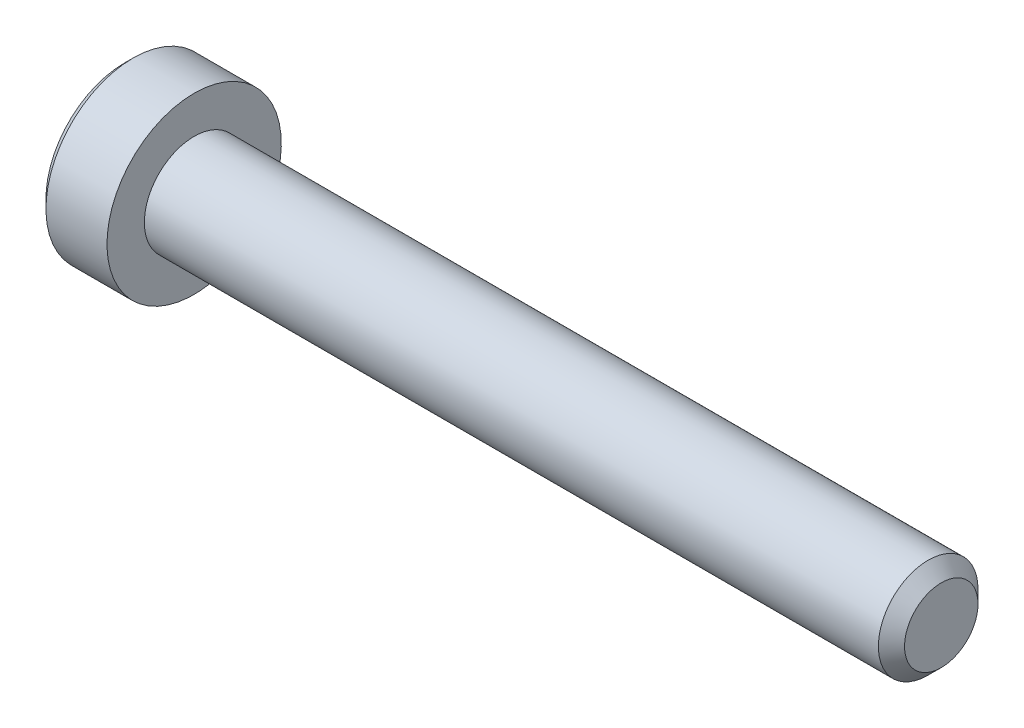
ISO-10303-21;
HEADER;
FILE_DESCRIPTION(('STEP AP214'),'2;1');
FILE_NAME('part.step','',(''),(''),'','','');
FILE_SCHEMA(('AUTOMOTIVE_DESIGN { 1 0 10303 214 1 1 1 1 }'));
ENDSEC;
DATA;
#1=APPLICATION_CONTEXT('core data for automotive mechanical design processes');
#2=APPLICATION_PROTOCOL_DEFINITION('international standard','automotive_design',2000,#1);
#3=PRODUCT_CONTEXT('',#1,'mechanical');
#4=PRODUCT('Part','Part','',(#3));
#5=PRODUCT_RELATED_PRODUCT_CATEGORY('part','',(#4));
#6=PRODUCT_DEFINITION_FORMATION('','',#4);
#7=PRODUCT_DEFINITION_CONTEXT('part definition',#1,'design');
#8=PRODUCT_DEFINITION('design','',#6,#7);
#9=PRODUCT_DEFINITION_SHAPE('','',#8);
#10=(LENGTH_UNIT() NAMED_UNIT(*) SI_UNIT(.MILLI.,.METRE.));
#11=(NAMED_UNIT(*) PLANE_ANGLE_UNIT() SI_UNIT($,.RADIAN.));
#12=(NAMED_UNIT(*) SI_UNIT($,.STERADIAN.) SOLID_ANGLE_UNIT());
#13=UNCERTAINTY_MEASURE_WITH_UNIT(LENGTH_MEASURE(1.E-05),#10,'distance_accuracy_value','');
#14=(GEOMETRIC_REPRESENTATION_CONTEXT(3) GLOBAL_UNCERTAINTY_ASSIGNED_CONTEXT((#13)) GLOBAL_UNIT_ASSIGNED_CONTEXT((#10,
#11,#12)) REPRESENTATION_CONTEXT('',''));
#15=CARTESIAN_POINT('',(0.,0.,0.));
#16=DIRECTION('',(0.,0.,1.));
#17=DIRECTION('',(1.,0.,0.));
#18=AXIS2_PLACEMENT_3D('',#15,#16,#17);
#19=CARTESIAN_POINT('',(-17.8,3.14999999999999,0.));
#20=DIRECTION('',(-1.,0.,0.));
#21=DIRECTION('',(0.,-1.,0.));
#22=AXIS2_PLACEMENT_3D('',#19,#20,#21);
#23=PLANE('',#22);
#24=CARTESIAN_POINT('',(-17.8,0.,0.));
#25=DIRECTION('',(-1.,0.,0.));
#26=DIRECTION('',(0.,-1.,0.));
#27=AXIS2_PLACEMENT_3D('',#24,#25,#26);
#28=CIRCLE('',#27,1.44337567297392);
#29=CARTESIAN_POINT('',(-17.8,-1.44337567297387,-3.25043811311154E-13));
#30=VERTEX_POINT('',#29);
#31=CARTESIAN_POINT('',(-17.8,-0.721687836487192,1.24999999999972));
#32=VERTEX_POINT('',#31);
#33=EDGE_CURVE('E136',#30,#32,#28,.T.);
#34=ORIENTED_EDGE('',*,*,#33,.F.);
#35=CARTESIAN_POINT('',(-17.8,-0.721687836487029,-1.25));
#36=VERTEX_POINT('',#35);
#37=EDGE_CURVE('E135',#36,#30,#28,.T.);
#38=ORIENTED_EDGE('',*,*,#37,.F.);
#39=CARTESIAN_POINT('',(-17.8,0.721687836486811,-1.25));
#40=VERTEX_POINT('',#39);
#41=EDGE_CURVE('E105',#40,#36,#28,.T.);
#42=ORIENTED_EDGE('',*,*,#41,.F.);
#43=CARTESIAN_POINT('',(-17.8,1.44337567297398,1.47668335892526E-13));
#44=VERTEX_POINT('',#43);
#45=EDGE_CURVE('E98',#44,#40,#28,.T.);
#46=ORIENTED_EDGE('',*,*,#45,.F.);
#47=CARTESIAN_POINT('',(-17.8,0.721687836486807,1.25));
#48=VERTEX_POINT('',#47);
#49=EDGE_CURVE('E59',#48,#44,#28,.T.);
#50=ORIENTED_EDGE('',*,*,#49,.F.);
#51=EDGE_CURVE('E66',#32,#48,#28,.T.);
#52=ORIENTED_EDGE('',*,*,#51,.F.);
#53=EDGE_LOOP('',(#34,#38,#42,#46,#50,#52));
#54=FACE_BOUND('',#53,.T.);
#55=CARTESIAN_POINT('',(-17.8,0.,0.));
#56=DIRECTION('',(1.,0.,0.));
#57=DIRECTION('',(0.,1.,0.));
#58=AXIS2_PLACEMENT_3D('',#55,#56,#57);
#59=CIRCLE('',#58,3.14999999999999);
#60=CARTESIAN_POINT('',(-17.8,3.14999999999999,0.));
#61=VERTEX_POINT('',#60);
#62=EDGE_CURVE('E226',#61,#61,#59,.T.);
#63=ORIENTED_EDGE('',*,*,#62,.F.);
#64=EDGE_LOOP('',(#63));
#65=FACE_BOUND('',#64,.T.);
#66=ADVANCED_FACE('F39',(#54,#65),#23,.T.);
#67=CARTESIAN_POINT('',(0.999999999999999,0.,0.));
#68=DIRECTION('',(1.,0.,0.));
#69=DIRECTION('',(0.,0.,-1.));
#70=AXIS2_PLACEMENT_3D('',#67,#68,#69);
#71=CYLINDRICAL_SURFACE('',#70,2.);
#72=CARTESIAN_POINT('',(14.475,0.,0.));
#73=DIRECTION('',(1.,0.,0.));
#74=DIRECTION('',(0.,0.,-1.));
#75=AXIS2_PLACEMENT_3D('',#72,#73,#74);
#76=CIRCLE('',#75,2.);
#77=CARTESIAN_POINT('',(14.475,0.,-2.));
#78=VERTEX_POINT('',#77);
#79=EDGE_CURVE('E53',#78,#78,#76,.F.);
#80=ORIENTED_EDGE('',*,*,#79,.T.);
#81=EDGE_LOOP('',(#80));
#82=FACE_BOUND('',#81,.T.);
#83=CARTESIAN_POINT('',(-15.,0.,0.));
#84=DIRECTION('',(-1.,0.,0.));
#85=DIRECTION('',(0.,-1.,0.));
#86=AXIS2_PLACEMENT_3D('',#83,#84,#85);
#87=CIRCLE('',#86,2.);
#88=CARTESIAN_POINT('',(-15.,-2.,0.));
#89=VERTEX_POINT('',#88);
#90=EDGE_CURVE('E219',#89,#89,#87,.T.);
#91=ORIENTED_EDGE('',*,*,#90,.F.);
#92=EDGE_LOOP('',(#91));
#93=FACE_BOUND('',#92,.T.);
#94=ADVANCED_FACE('F198',(#82,#93),#71,.T.);
#95=CARTESIAN_POINT('',(15.,0.,0.));
#96=DIRECTION('',(1.,0.,0.));
#97=DIRECTION('',(0.,0.,-1.));
#98=AXIS2_PLACEMENT_3D('',#95,#96,#97);
#99=PLANE('',#98);
#100=CARTESIAN_POINT('',(15.,0.,0.));
#101=DIRECTION('',(1.,0.,0.));
#102=DIRECTION('',(0.,0.,-1.));
#103=AXIS2_PLACEMENT_3D('',#100,#101,#102);
#104=CIRCLE('',#103,1.475);
#105=CARTESIAN_POINT('',(15.,0.,-1.475));
#106=VERTEX_POINT('',#105);
#107=EDGE_CURVE('E220',#106,#106,#104,.T.);
#108=ORIENTED_EDGE('',*,*,#107,.T.);
#109=EDGE_LOOP('',(#108));
#110=FACE_BOUND('',#109,.T.);
#111=ADVANCED_FACE('F206',(#110),#99,.T.);
#112=CARTESIAN_POINT('',(15.,0.,0.));
#113=DIRECTION('',(-1.,0.,0.));
#114=DIRECTION('',(0.,0.,1.));
#115=AXIS2_PLACEMENT_3D('',#112,#113,#114);
#116=CONICAL_SURFACE('',#115,1.475,0.785398163397445);
#117=ORIENTED_EDGE('',*,*,#79,.F.);
#118=EDGE_LOOP('',(#117));
#119=FACE_BOUND('',#118,.T.);
#120=ORIENTED_EDGE('',*,*,#107,.F.);
#121=EDGE_LOOP('',(#120));
#122=FACE_BOUND('',#121,.T.);
#123=ADVANCED_FACE('F41',(#119,#122),#116,.T.);
#124=CARTESIAN_POINT('',(-15.,0.,0.));
#125=DIRECTION('',(1.,0.,0.));
#126=DIRECTION('',(0.,1.,0.));
#127=AXIS2_PLACEMENT_3D('',#124,#125,#126);
#128=CYLINDRICAL_SURFACE('',#127,3.49999999999999);
#129=CARTESIAN_POINT('',(-17.45,0.,0.));
#130=DIRECTION('',(1.,0.,0.));
#131=DIRECTION('',(0.,1.,0.));
#132=AXIS2_PLACEMENT_3D('',#129,#130,#131);
#133=CIRCLE('',#132,3.49999999999999);
#134=CARTESIAN_POINT('',(-17.45,3.49999999999999,0.));
#135=VERTEX_POINT('',#134);
#136=EDGE_CURVE('E221',#135,#135,#133,.T.);
#137=ORIENTED_EDGE('',*,*,#136,.T.);
#138=EDGE_LOOP('',(#137));
#139=FACE_BOUND('',#138,.T.);
#140=CARTESIAN_POINT('',(-15.,0.,0.));
#141=DIRECTION('',(1.,0.,0.));
#142=DIRECTION('',(0.,1.,0.));
#143=AXIS2_PLACEMENT_3D('',#140,#141,#142);
#144=CIRCLE('',#143,3.5);
#145=CARTESIAN_POINT('',(-15.,3.49999999999999,0.));
#146=VERTEX_POINT('',#145);
#147=EDGE_CURVE('E231',#146,#146,#144,.T.);
#148=ORIENTED_EDGE('',*,*,#147,.F.);
#149=EDGE_LOOP('',(#148));
#150=FACE_BOUND('',#149,.T.);
#151=ADVANCED_FACE('F201',(#139,#150),#128,.T.);
#152=CARTESIAN_POINT('',(-17.45,0.,0.));
#153=DIRECTION('',(1.,0.,0.));
#154=DIRECTION('',(0.,1.,0.));
#155=AXIS2_PLACEMENT_3D('',#152,#153,#154);
#156=CONICAL_SURFACE('',#155,3.49999999999999,0.78539816339745);
#157=ORIENTED_EDGE('',*,*,#62,.T.);
#158=EDGE_LOOP('',(#157));
#159=FACE_BOUND('',#158,.T.);
#160=ORIENTED_EDGE('',*,*,#136,.F.);
#161=EDGE_LOOP('',(#160));
#162=FACE_BOUND('',#161,.T.);
#163=ADVANCED_FACE('F194',(#159,#162),#156,.T.);
#164=CARTESIAN_POINT('',(-15.,3.49999999999999,0.));
#165=DIRECTION('',(1.,0.,0.));
#166=DIRECTION('',(0.,1.,0.));
#167=AXIS2_PLACEMENT_3D('',#164,#165,#166);
#168=PLANE('',#167);
#169=ORIENTED_EDGE('',*,*,#90,.T.);
#170=EDGE_LOOP('',(#169));
#171=FACE_BOUND('',#170,.T.);
#172=ORIENTED_EDGE('',*,*,#147,.T.);
#173=EDGE_LOOP('',(#172));
#174=FACE_BOUND('',#173,.T.);
#175=ADVANCED_FACE('F158',(#171,#174),#168,.T.);
#176=CARTESIAN_POINT('',(-17.8,0.,0.));
#177=DIRECTION('',(-1.,0.,0.));
#178=DIRECTION('',(0.,-1.,0.));
#179=AXIS2_PLACEMENT_3D('',#176,#177,#178);
#180=CONICAL_SURFACE('',#179,1.44337567297392,0.78539816339745);
#181=CARTESIAN_POINT('',(-18.2629820970506,-1.43934010829013,-1.25));
#182=CARTESIAN_POINT('',(-18.2365249227851,-1.40429313026007,-1.25));
#183=CARTESIAN_POINT('',(-18.2103271605004,-1.36905087155358,-1.25));
#184=CARTESIAN_POINT('',(-18.1585575719735,-1.29809650724885,-1.25));
#185=CARTESIAN_POINT('',(-18.1329859044842,-1.26238428594474,-1.25));
#186=CARTESIAN_POINT('',(-18.0570059937991,-1.15390111808865,-1.25));
#187=CARTESIAN_POINT('',(-18.0077402862871,-1.08031646741182,-1.25));
#188=CARTESIAN_POINT('',(-17.9110258303358,-0.926012322877247,-1.25));
#189=CARTESIAN_POINT('',(-17.8638412990017,-0.845125318763593,-1.25));
#190=CARTESIAN_POINT('',(-17.7775307344268,-0.679311174153388,-1.25));
#191=CARTESIAN_POINT('',(-17.7383775346524,-0.594398891087529,-1.25));
#192=CARTESIAN_POINT('',(-17.6904772237057,-0.466944812509586,-1.25));
#193=CARTESIAN_POINT('',(-17.676729489804,-0.426289985866692,-1.25));
#194=CARTESIAN_POINT('',(-17.6524979274679,-0.343998850155351,-1.25));
#195=CARTESIAN_POINT('',(-17.6420143238864,-0.302362473684234,-1.25));
#196=CARTESIAN_POINT('',(-17.6250301617623,-0.219052696365143,-1.25));
#197=CARTESIAN_POINT('',(-17.6184613604836,-0.177393428558993,-1.25));
#198=CARTESIAN_POINT('',(-17.6094350534651,-0.0936293694345473,-1.25));
#199=CARTESIAN_POINT('',(-17.6069768410017,-0.0515246559535982,-1.25));
#200=CARTESIAN_POINT('',(-17.6063540620109,0.0311890575224892,-1.25));
#201=CARTESIAN_POINT('',(-17.6080371168401,0.0717969624376823,-1.25));
#202=CARTESIAN_POINT('',(-17.6152682705836,0.152668636765143,-1.25));
#203=CARTESIAN_POINT('',(-17.6208171103944,0.192932338711604,-1.25));
#204=CARTESIAN_POINT('',(-17.6355710364371,0.273499879034239,-1.25));
#205=CARTESIAN_POINT('',(-17.6448381759315,0.313792180483865,-1.25));
#206=CARTESIAN_POINT('',(-17.666536178415,0.393496413769976,-1.25));
#207=CARTESIAN_POINT('',(-17.6789667766834,0.432908418970333,-1.25));
#208=CARTESIAN_POINT('',(-17.7227793528611,0.556992735686046,-1.25));
#209=CARTESIAN_POINT('',(-17.7591510727843,0.639898924463133,-1.25));
#210=CARTESIAN_POINT('',(-17.8400191620418,0.801816555245396,-1.25));
#211=CARTESIAN_POINT('',(-17.8845447207518,0.8808126660461,-1.25));
#212=CARTESIAN_POINT('',(-17.9764048764611,1.03178561247426,-1.25));
#213=CARTESIAN_POINT('',(-18.0234899336894,1.1039161845078,-1.25));
#214=CARTESIAN_POINT('',(-18.0962785613397,1.21018606006075,-1.25));
#215=CARTESIAN_POINT('',(-18.1207980851239,1.24515069931181,-1.25));
#216=CARTESIAN_POINT('',(-18.1704856364751,1.31460220812619,-1.25));
#217=CARTESIAN_POINT('',(-18.1956534851143,1.34908920555544,-1.25));
#218=CARTESIAN_POINT('',(-18.2210901485295,1.38337731640883,-1.25));
#219=B_SPLINE_CURVE_WITH_KNOTS('',3,(#181,#182,#183,#184,#185,#186,#187,#188,#189,#190,#191,
#192,#193,#194,#195,#196,#197,#198,#199,#200,#201,#202,#203,#204,#205,#206,#207,#208,#209,#210,
#211,#212,#213,#214,#215,#216,#217,#218),.UNSPECIFIED.,.F.,.F.,(4,2,2,2,2,2,2,2,2,2,2,2,2,2,2,2,
2,2,4),(0.,0.131732960406521,0.2634989842118,0.529042014557079,0.809741926293176,
1.08947609738757,1.21811634292655,1.34676544802529,1.47310084535081,1.59941451989631,
1.72115042182423,1.84290966145033,1.96679153917268,2.09066305376594,2.36146692896706,
2.63325989189266,2.89154668194564,3.0196573448581,3.14773302219538),.UNSPECIFIED.);
#220=EDGE_CURVE('E11',#36,#40,#219,.T.);
#221=ORIENTED_EDGE('',*,*,#220,.T.);
#222=ORIENTED_EDGE('',*,*,#41,.T.);
#223=EDGE_LOOP('',(#221,#222));
#224=FACE_BOUND('',#223,.T.);
#225=ADVANCED_FACE('F110',(#224),#180,.F.);
#226=CARTESIAN_POINT('',(-17.8001154839093,-1.4434911430279,0.000199999999999588));
#227=CARTESIAN_POINT('',(-17.7753216680553,-1.41867941875065,-0.0427751670715874));
#228=CARTESIAN_POINT('',(-17.7519837344189,-1.39345276980743,-0.0864690047459494));
#229=CARTESIAN_POINT('',(-17.7092520040847,-1.34201263554193,-0.175565930841946));
#230=CARTESIAN_POINT('',(-17.6898819923606,-1.31579425481275,-0.22097749835707));
#231=CARTESIAN_POINT('',(-17.6567004834137,-1.26292610442245,-0.312547820935269));
#232=CARTESIAN_POINT('',(-17.6428055590528,-1.2362898077047,-0.358683240175896));
#233=CARTESIAN_POINT('',(-17.6213972821608,-1.18243062538507,-0.451970080407606));
#234=CARTESIAN_POINT('',(-17.613867941567,-1.1552093865376,-0.499118649136394));
#235=CARTESIAN_POINT('',(-17.6070744980509,-1.10829684367465,-0.580373556887269));
#236=CARTESIAN_POINT('',(-17.6060685591045,-1.08866617256956,-0.614374876627959));
#237=CARTESIAN_POINT('',(-17.6077614149115,-1.04943932800609,-0.682317764432497));
#238=CARTESIAN_POINT('',(-17.6104610272157,-1.02984316311598,-0.716259317655678));
#239=CARTESIAN_POINT('',(-17.6194089303166,-0.99083995460348,-0.783814856457522));
#240=CARTESIAN_POINT('',(-17.6256605258999,-0.971433104248751,-0.817428507286799));
#241=CARTESIAN_POINT('',(-17.6413756814141,-0.932943395609884,-0.884094638217839));
#242=CARTESIAN_POINT('',(-17.6508406200876,-0.913860680098279,-0.917146871030322));
#243=CARTESIAN_POINT('',(-17.6789313906878,-0.864986351354549,-1.00179969160029));
#244=CARTESIAN_POINT('',(-17.6996701574524,-0.83550292014906,-1.05286649242965));
#245=CARTESIAN_POINT('',(-17.7463871346716,-0.777690319475899,-1.15300085411326));
#246=CARTESIAN_POINT('',(-17.7723482959469,-0.74935774559841,-1.20207431157827));
#247=CARTESIAN_POINT('',(-17.8001154839093,-0.721572366433191,-1.2502));
#248=B_SPLINE_CURVE_WITH_KNOTS('',3,(#226,#227,#228,#229,#230,#231,#232,#233,#234,#235,#236,
#237,#238,#239,#240,#241,#242,#243,#244,#245,#246,#247),.UNSPECIFIED.,.F.,.F.,(4,2,2,2,2,2,2,2,
2,2,4),(0.,0.166533409618307,0.334037607289771,0.498880396489713,0.663307919240294,
0.78096396345885,0.898645970148479,1.01643764860776,1.13427993171553,1.32148652032142,
1.50809158792573),.UNSPECIFIED.);
#249=EDGE_CURVE('E138',#30,#36,#248,.T.);
#250=ORIENTED_EDGE('',*,*,#249,.T.);
#251=ORIENTED_EDGE('',*,*,#37,.T.);
#252=EDGE_LOOP('',(#250,#251));
#253=FACE_BOUND('',#252,.T.);
#254=ADVANCED_FACE('F157',(#253),#180,.F.);
#255=CARTESIAN_POINT('',(-17.8001154839093,-0.721572366433191,1.2502));
#256=CARTESIAN_POINT('',(-17.7753216680553,-0.74638409071044,1.20722483292841));
#257=CARTESIAN_POINT('',(-17.7519837344189,-0.77161073965366,1.16353099525405));
#258=CARTESIAN_POINT('',(-17.7092520040847,-0.823050873919149,1.07443406915806));
#259=CARTESIAN_POINT('',(-17.6898819923606,-0.849269254648326,1.02902250164294));
#260=CARTESIAN_POINT('',(-17.6567004834137,-0.902137405038626,0.937452179064747));
#261=CARTESIAN_POINT('',(-17.6428055590528,-0.928773701756376,0.891316759824123));
#262=CARTESIAN_POINT('',(-17.6213972821608,-0.982632884076,0.79802991959242));
#263=CARTESIAN_POINT('',(-17.613867941567,-1.00985412292347,0.750881350863634));
#264=CARTESIAN_POINT('',(-17.6070744980509,-1.05676666578641,0.669626443112762));
#265=CARTESIAN_POINT('',(-17.6060685591045,-1.0763973368915,0.635625123372073));
#266=CARTESIAN_POINT('',(-17.6077614149115,-1.11562418145497,0.567682235567535));
#267=CARTESIAN_POINT('',(-17.6104610272157,-1.13522034634509,0.533740682344354));
#268=CARTESIAN_POINT('',(-17.6194089303166,-1.17422355485759,0.46618514354251));
#269=CARTESIAN_POINT('',(-17.6256605258999,-1.19363040521231,0.432571492713234));
#270=CARTESIAN_POINT('',(-17.6413756814141,-1.23212011385118,0.365905361782195));
#271=CARTESIAN_POINT('',(-17.6508406200876,-1.25120282936279,0.332853128969711));
#272=CARTESIAN_POINT('',(-17.6789313906878,-1.30007715810652,0.24820030839974));
#273=CARTESIAN_POINT('',(-17.6996701574524,-1.32956058931201,0.197133507570365));
#274=CARTESIAN_POINT('',(-17.7463871346717,-1.38737318998518,0.096999145886746));
#275=CARTESIAN_POINT('',(-17.772348295947,-1.41570576386267,0.0479256884217306));
#276=CARTESIAN_POINT('',(-17.8001154839093,-1.4434911430279,-0.000200000000000639));
#277=B_SPLINE_CURVE_WITH_KNOTS('',3,(#255,#256,#257,#258,#259,#260,#261,#262,#263,#264,#265,
#266,#267,#268,#269,#270,#271,#272,#273,#274,#275,#276),.UNSPECIFIED.,.F.,.F.,(4,2,2,2,2,2,2,2,
2,2,4),(0.,0.166533409618298,0.334037607289748,0.498880396489677,0.663307919240247,
0.780963963458802,0.898645970148431,1.01643764860771,1.13427993171548,1.3214865203214,
1.50809158792573),.UNSPECIFIED.);
#278=EDGE_CURVE('E145',#32,#30,#277,.T.);
#279=ORIENTED_EDGE('',*,*,#278,.T.);
#280=ORIENTED_EDGE('',*,*,#33,.T.);
#281=EDGE_LOOP('',(#279,#280));
#282=FACE_BOUND('',#281,.T.);
#283=ADVANCED_FACE('F264',(#282),#180,.F.);
#284=CARTESIAN_POINT('',(-18.2629820968925,-1.43934010808071,1.25));
#285=CARTESIAN_POINT('',(-18.236524922633,-1.40429313005653,1.25));
#286=CARTESIAN_POINT('',(-18.2103271603544,-1.36905087135593,1.25));
#287=CARTESIAN_POINT('',(-18.1585575718397,-1.29809650706305,1.25));
#288=CARTESIAN_POINT('',(-18.1329859043564,-1.2623842857649,1.25));
#289=CARTESIAN_POINT('',(-18.0570059936896,-1.15390111792702,1.25));
#290=CARTESIAN_POINT('',(-18.0077402861897,-1.08031646726259,1.25));
#291=CARTESIAN_POINT('',(-17.9110258302633,-0.926012322755041,1.25));
#292=CARTESIAN_POINT('',(-17.8638412989419,-0.845125318656092,1.25));
#293=CARTESIAN_POINT('',(-17.7775307343906,-0.679311174076548,1.25));
#294=CARTESIAN_POINT('',(-17.738377534627,-0.594398891026634,1.25));
#295=CARTESIAN_POINT('',(-17.6904772236884,-0.466944812460687,1.25));
#296=CARTESIAN_POINT('',(-17.6767294897865,-0.426289985812769,1.25));
#297=CARTESIAN_POINT('',(-17.6524979274507,-0.343998850091214,1.25));
#298=CARTESIAN_POINT('',(-17.6420143238699,-0.302362473614909,1.25));
#299=CARTESIAN_POINT('',(-17.6250301617484,-0.219052696285613,1.25));
#300=CARTESIAN_POINT('',(-17.6184613604715,-0.177393428474448,1.25));
#301=CARTESIAN_POINT('',(-17.6094350534579,-0.0936293693401404,1.25));
#302=CARTESIAN_POINT('',(-17.6069768409974,-0.0515246558543445,1.25));
#303=CARTESIAN_POINT('',(-17.6063540620134,0.031189057630683,1.25));
#304=CARTESIAN_POINT('',(-17.6080371168464,0.0717969625499818,1.25));
#305=CARTESIAN_POINT('',(-17.615268270598,0.152668636885249,1.25));
#306=CARTESIAN_POINT('',(-17.6208171104132,0.19293233883541,1.25));
#307=CARTESIAN_POINT('',(-17.6355710364651,0.273499879165347,1.25));
#308=CARTESIAN_POINT('',(-17.6448381759642,0.313792180618563,1.25));
#309=CARTESIAN_POINT('',(-17.6665361784575,0.393496413911509,1.25));
#310=CARTESIAN_POINT('',(-17.6789667767308,0.43290841911511,1.25));
#311=CARTESIAN_POINT('',(-17.7227793529316,0.556992735862349,1.25));
#312=CARTESIAN_POINT('',(-17.7591510728761,0.639898924666136,1.25));
#313=CARTESIAN_POINT('',(-17.8400191621785,0.801816555499751,1.25));
#314=CARTESIAN_POINT('',(-17.8845447209121,0.880812666325094,1.25));
#315=CARTESIAN_POINT('',(-17.9764048766668,1.03178561279755,1.25));
#316=CARTESIAN_POINT('',(-18.0234899339164,1.10391618485091,1.25));
#317=CARTESIAN_POINT('',(-18.0962785615987,1.21018606043316,1.25));
#318=CARTESIAN_POINT('',(-18.1207980853935,1.24515069969385,1.25));
#319=CARTESIAN_POINT('',(-18.1704856367658,1.31460220852742,1.25));
#320=CARTESIAN_POINT('',(-18.1956534854157,1.34908920596623,1.25));
#321=CARTESIAN_POINT('',(-18.2210901488413,1.38337731682917,1.25));
#322=B_SPLINE_CURVE_WITH_KNOTS('',3,(#284,#285,#286,#287,#288,#289,#290,#291,#292,#293,#294,
#295,#296,#297,#298,#299,#300,#301,#302,#303,#304,#305,#306,#307,#308,#309,#310,#311,#312,#313,
#314,#315,#316,#317,#318,#319,#320,#321),.UNSPECIFIED.,.F.,.F.,(4,2,2,2,2,2,2,2,2,2,2,2,2,2,2,2,
2,2,4),(0.,0.131732960381448,0.263498984161644,0.529042014455825,0.809741926134617,
1.08947609717225,1.21811634272576,1.346765447839,1.47310084517844,1.59941451973784,
1.72115042167849,1.84290966131734,1.96679153905341,2.09066305366039,2.36146692896008,
2.63325989198491,2.89154668212279,3.01965734507712,3.14773302245628),.UNSPECIFIED.);
#323=EDGE_CURVE('E165',#48,#32,#322,.F.);
#324=ORIENTED_EDGE('',*,*,#323,.T.);
#325=ORIENTED_EDGE('',*,*,#51,.T.);
#326=EDGE_LOOP('',(#324,#325));
#327=FACE_BOUND('',#326,.T.);
#328=ADVANCED_FACE('F280',(#327),#180,.F.);
#329=CARTESIAN_POINT('',(-17.8001154839092,1.4434911430279,-0.000199999999998723));
#330=CARTESIAN_POINT('',(-17.7753216680552,1.41867941875065,0.0427751670715864));
#331=CARTESIAN_POINT('',(-17.7519837344188,1.39345276980743,0.0864690047459465));
#332=CARTESIAN_POINT('',(-17.7092520040846,1.34201263554194,0.175565930841938));
#333=CARTESIAN_POINT('',(-17.6898819923605,1.31579425481276,0.220977498357059));
#334=CARTESIAN_POINT('',(-17.6567004834136,1.26292610442246,0.312547820935253));
#335=CARTESIAN_POINT('',(-17.6428055590527,1.23628980770471,0.358683240175876));
#336=CARTESIAN_POINT('',(-17.6213972821607,1.18243062538509,0.45197008040758));
#337=CARTESIAN_POINT('',(-17.6138679415669,1.15520938653762,0.499118649136366));
#338=CARTESIAN_POINT('',(-17.6070744980508,1.10829684367467,0.580373556887236));
#339=CARTESIAN_POINT('',(-17.6060685591044,1.08866617256959,0.614374876627923));
#340=CARTESIAN_POINT('',(-17.6077614149114,1.04943932800612,0.682317764432457));
#341=CARTESIAN_POINT('',(-17.6104610272156,1.029843163116,0.716259317655636));
#342=CARTESIAN_POINT('',(-17.6194089303165,0.990839954603508,0.783814856457475));
#343=CARTESIAN_POINT('',(-17.6256605258998,0.971433104248781,0.81742850728675));
#344=CARTESIAN_POINT('',(-17.641375681414,0.932943395609917,0.884094638217785));
#345=CARTESIAN_POINT('',(-17.6508406200875,0.913860680098312,0.917146871030267));
#346=CARTESIAN_POINT('',(-17.6789313906877,0.864986351354578,1.00179969160024));
#347=CARTESIAN_POINT('',(-17.6996701574523,0.835502920149083,1.05286649242962));
#348=CARTESIAN_POINT('',(-17.7463871346716,0.77769031947591,1.15300085411324));
#349=CARTESIAN_POINT('',(-17.7723482959469,0.749357745598416,1.20207431157826));
#350=CARTESIAN_POINT('',(-17.8001154839092,0.721572366433191,1.2502));
#351=B_SPLINE_CURVE_WITH_KNOTS('',3,(#329,#330,#331,#332,#333,#334,#335,#336,#337,#338,#339,
#340,#341,#342,#343,#344,#345,#346,#347,#348,#349,#350),.UNSPECIFIED.,.F.,.F.,(4,2,2,2,2,2,2,2,
2,2,4),(0.,0.166533409618298,0.334037607289752,0.498880396489683,0.663307919240253,
0.780963963458802,0.898645970148424,1.0164376486077,1.13427993171546,1.32148652032139,
1.50809158792573),.UNSPECIFIED.);
#352=EDGE_CURVE('E125',#44,#48,#351,.T.);
#353=ORIENTED_EDGE('',*,*,#352,.T.);
#354=ORIENTED_EDGE('',*,*,#49,.T.);
#355=EDGE_LOOP('',(#353,#354));
#356=FACE_BOUND('',#355,.T.);
#357=ADVANCED_FACE('F256',(#356),#180,.F.);
#358=CARTESIAN_POINT('',(-17.8001154839092,0.721572366433193,-1.2502));
#359=CARTESIAN_POINT('',(-17.7753216680552,0.746384090710443,-1.20722483292841));
#360=CARTESIAN_POINT('',(-17.7519837344188,0.771610739653664,-1.16353099525405));
#361=CARTESIAN_POINT('',(-17.7092520040846,0.823050873919155,-1.07443406915805));
#362=CARTESIAN_POINT('',(-17.6898819923605,0.849269254648334,-1.02902250164293));
#363=CARTESIAN_POINT('',(-17.6567004834136,0.902137405038638,-0.937452179064728));
#364=CARTESIAN_POINT('',(-17.6428055590527,0.92877370175639,-0.891316759824102));
#365=CARTESIAN_POINT('',(-17.6213972821607,0.982632884076017,-0.798029919592392));
#366=CARTESIAN_POINT('',(-17.6138679415669,1.00985412292349,-0.750881350863604));
#367=CARTESIAN_POINT('',(-17.6070744980508,1.05676666578643,-0.669626443112731));
#368=CARTESIAN_POINT('',(-17.6060685591044,1.07639733689152,-0.635625123372044));
#369=CARTESIAN_POINT('',(-17.6077614149114,1.11562418145499,-0.567682235567509));
#370=CARTESIAN_POINT('',(-17.6104610272156,1.13522034634511,-0.53374068234433));
#371=CARTESIAN_POINT('',(-17.6194089303165,1.1742235548576,-0.46618514354249));
#372=CARTESIAN_POINT('',(-17.6256605258998,1.19363040521233,-0.432571492713216));
#373=CARTESIAN_POINT('',(-17.641375681414,1.23212011385119,-0.36590536178218));
#374=CARTESIAN_POINT('',(-17.6508406200875,1.25120282936279,-0.332853128969699));
#375=CARTESIAN_POINT('',(-17.6789313906877,1.30007715810653,-0.248200308399731));
#376=CARTESIAN_POINT('',(-17.6996701574523,1.32956058931202,-0.197133507570358));
#377=CARTESIAN_POINT('',(-17.7463871346716,1.38737318998518,-0.0969991458867432));
#378=CARTESIAN_POINT('',(-17.7723482959468,1.41570576386268,-0.0479256884217291));
#379=CARTESIAN_POINT('',(-17.8001154839092,1.4434911430279,0.000200000000001103));
#380=B_SPLINE_CURVE_WITH_KNOTS('',3,(#358,#359,#360,#361,#362,#363,#364,#365,#366,#367,#368,
#369,#370,#371,#372,#373,#374,#375,#376,#377,#378,#379),.UNSPECIFIED.,.F.,.F.,(4,2,2,2,2,2,2,2,
2,2,4),(0.,0.166533409618309,0.334037607289773,0.498880396489713,0.663307919240294,
0.780963963458843,0.898645970148465,1.01643764860774,1.1342799317155,1.32148652032141,
1.50809158792573),.UNSPECIFIED.);
#381=EDGE_CURVE('E101',#40,#44,#380,.T.);
#382=ORIENTED_EDGE('',*,*,#381,.T.);
#383=ORIENTED_EDGE('',*,*,#45,.T.);
#384=EDGE_LOOP('',(#382,#383));
#385=FACE_BOUND('',#384,.T.);
#386=ADVANCED_FACE('F99',(#385),#180,.F.);
#387=CARTESIAN_POINT('',(-15.38,1.44337567297406,0.));
#388=DIRECTION('',(1.,0.,0.));
#389=DIRECTION('',(0.,0.,-1.));
#390=AXIS2_PLACEMENT_3D('',#387,#388,#389);
#391=PLANE('',#390);
#392=DIRECTION('',(0.,0.499999999999999,0.866025403784439));
#393=VECTOR('',#392,1.);
#394=CARTESIAN_POINT('',(-15.38,0.721687836487031,-1.25));
#395=LINE('',#394,#393);
#396=CARTESIAN_POINT('',(-15.38,0.721687836487031,-1.25));
#397=VERTEX_POINT('',#396);
#398=CARTESIAN_POINT('',(-15.38,1.44337567297406,0.));
#399=VERTEX_POINT('',#398);
#400=EDGE_CURVE('E124',#397,#399,#395,.T.);
#401=ORIENTED_EDGE('',*,*,#400,.F.);
#402=DIRECTION('',(0.,1.,0.));
#403=VECTOR('',#402,1.);
#404=CARTESIAN_POINT('',(-15.38,-0.721687836487029,-1.25));
#405=LINE('',#404,#403);
#406=CARTESIAN_POINT('',(-15.38,-0.721687836487029,-1.25));
#407=VERTEX_POINT('',#406);
#408=EDGE_CURVE('E129',#407,#397,#405,.T.);
#409=ORIENTED_EDGE('',*,*,#408,.F.);
#410=DIRECTION('',(0.,0.500000000000001,-0.866025403784438));
#411=VECTOR('',#410,1.);
#412=CARTESIAN_POINT('',(-15.38,-1.44337567297406,0.));
#413=LINE('',#412,#411);
#414=CARTESIAN_POINT('',(-15.38,-1.44337567297406,0.));
#415=VERTEX_POINT('',#414);
#416=EDGE_CURVE('E246',#415,#407,#413,.T.);
#417=ORIENTED_EDGE('',*,*,#416,.F.);
#418=DIRECTION('',(0.,-0.499999999999999,-0.866025403784439));
#419=VECTOR('',#418,1.);
#420=CARTESIAN_POINT('',(-15.38,-0.721687836487029,1.25));
#421=LINE('',#420,#419);
#422=CARTESIAN_POINT('',(-15.38,-0.721687836487029,1.25));
#423=VERTEX_POINT('',#422);
#424=EDGE_CURVE('E248',#423,#415,#421,.T.);
#425=ORIENTED_EDGE('',*,*,#424,.F.);
#426=DIRECTION('',(0.,-1.,0.));
#427=VECTOR('',#426,1.);
#428=CARTESIAN_POINT('',(-15.38,0.721687836487029,1.25));
#429=LINE('',#428,#427);
#430=CARTESIAN_POINT('',(-15.38,0.721687836487029,1.25));
#431=VERTEX_POINT('',#430);
#432=EDGE_CURVE('E250',#431,#423,#429,.T.);
#433=ORIENTED_EDGE('',*,*,#432,.F.);
#434=DIRECTION('',(0.,-0.500000000000001,0.866025403784438));
#435=VECTOR('',#434,1.);
#436=CARTESIAN_POINT('',(-15.38,1.44337567297406,0.));
#437=LINE('',#436,#435);
#438=EDGE_CURVE('E252',#399,#431,#437,.T.);
#439=ORIENTED_EDGE('',*,*,#438,.F.);
#440=EDGE_LOOP('',(#401,#409,#417,#425,#433,#439));
#441=FACE_BOUND('',#440,.T.);
#442=ADVANCED_FACE('F159',(#441),#391,.F.);
#443=CARTESIAN_POINT('',(-15.38,-0.721687836487029,-1.25));
#444=DIRECTION('',(0.,0.,1.));
#445=DIRECTION('',(0.,-1.,0.));
#446=AXIS2_PLACEMENT_3D('',#443,#444,#445);
#447=PLANE('',#446);
#448=ORIENTED_EDGE('',*,*,#220,.F.);
#449=DIRECTION('',(-1.,0.,0.));
#450=VECTOR('',#449,1.);
#451=CARTESIAN_POINT('',(-15.38,-0.721687836487029,-1.25));
#452=LINE('',#451,#450);
#453=EDGE_CURVE('E130',#407,#36,#452,.T.);
#454=ORIENTED_EDGE('',*,*,#453,.F.);
#455=ORIENTED_EDGE('',*,*,#408,.T.);
#456=DIRECTION('',(-1.,0.,0.));
#457=VECTOR('',#456,1.);
#458=CARTESIAN_POINT('',(-15.38,0.721687836487031,-1.25));
#459=LINE('',#458,#457);
#460=EDGE_CURVE('E120',#397,#40,#459,.T.);
#461=ORIENTED_EDGE('',*,*,#460,.T.);
#462=EDGE_LOOP('',(#448,#454,#455,#461));
#463=FACE_BOUND('',#462,.T.);
#464=ADVANCED_FACE('F127',(#463),#447,.T.);
#465=CARTESIAN_POINT('',(-15.38,-1.44337567297406,0.));
#466=DIRECTION('',(0.,0.866025403784438,0.500000000000001));
#467=DIRECTION('',(0.,-0.500000000000001,0.866025403784438));
#468=AXIS2_PLACEMENT_3D('',#465,#466,#467);
#469=PLANE('',#468);
#470=ORIENTED_EDGE('',*,*,#249,.F.);
#471=DIRECTION('',(-1.,0.,0.));
#472=VECTOR('',#471,1.);
#473=CARTESIAN_POINT('',(-15.38,-1.44337567297406,0.));
#474=LINE('',#473,#472);
#475=EDGE_CURVE('E241',#415,#30,#474,.T.);
#476=ORIENTED_EDGE('',*,*,#475,.F.);
#477=ORIENTED_EDGE('',*,*,#416,.T.);
#478=ORIENTED_EDGE('',*,*,#453,.T.);
#479=EDGE_LOOP('',(#470,#476,#477,#478));
#480=FACE_BOUND('',#479,.T.);
#481=ADVANCED_FACE('F152',(#480),#469,.T.);
#482=CARTESIAN_POINT('',(-15.38,-0.721687836487029,1.25));
#483=DIRECTION('',(0.,0.866025403784439,-0.499999999999999));
#484=DIRECTION('',(0.,0.5,0.866025403784439));
#485=AXIS2_PLACEMENT_3D('',#482,#483,#484);
#486=PLANE('',#485);
#487=ORIENTED_EDGE('',*,*,#278,.F.);
#488=DIRECTION('',(-1.,0.,0.));
#489=VECTOR('',#488,1.);
#490=CARTESIAN_POINT('',(-15.38,-0.721687836487029,1.25));
#491=LINE('',#490,#489);
#492=EDGE_CURVE('E238',#423,#32,#491,.T.);
#493=ORIENTED_EDGE('',*,*,#492,.F.);
#494=ORIENTED_EDGE('',*,*,#424,.T.);
#495=ORIENTED_EDGE('',*,*,#475,.T.);
#496=EDGE_LOOP('',(#487,#493,#494,#495));
#497=FACE_BOUND('',#496,.T.);
#498=ADVANCED_FACE('F270',(#497),#486,.T.);
#499=CARTESIAN_POINT('',(-15.38,0.721687836487029,1.25));
#500=DIRECTION('',(0.,0.,-1.));
#501=DIRECTION('',(0.,1.,0.));
#502=AXIS2_PLACEMENT_3D('',#499,#500,#501);
#503=PLANE('',#502);
#504=ORIENTED_EDGE('',*,*,#323,.F.);
#505=DIRECTION('',(-1.,0.,0.));
#506=VECTOR('',#505,1.);
#507=CARTESIAN_POINT('',(-15.38,0.721687836487029,1.25));
#508=LINE('',#507,#506);
#509=EDGE_CURVE('E235',#431,#48,#508,.T.);
#510=ORIENTED_EDGE('',*,*,#509,.F.);
#511=ORIENTED_EDGE('',*,*,#432,.T.);
#512=ORIENTED_EDGE('',*,*,#492,.T.);
#513=EDGE_LOOP('',(#504,#510,#511,#512));
#514=FACE_BOUND('',#513,.T.);
#515=ADVANCED_FACE('F186',(#514),#503,.T.);
#516=CARTESIAN_POINT('',(-15.38,1.44337567297406,0.));
#517=DIRECTION('',(0.,-0.866025403784438,-0.500000000000001));
#518=DIRECTION('',(0.,0.500000000000001,-0.866025403784438));
#519=AXIS2_PLACEMENT_3D('',#516,#517,#518);
#520=PLANE('',#519);
#521=ORIENTED_EDGE('',*,*,#352,.F.);
#522=DIRECTION('',(-1.,0.,0.));
#523=VECTOR('',#522,1.);
#524=CARTESIAN_POINT('',(-15.38,1.44337567297406,0.));
#525=LINE('',#524,#523);
#526=EDGE_CURVE('E123',#399,#44,#525,.T.);
#527=ORIENTED_EDGE('',*,*,#526,.F.);
#528=ORIENTED_EDGE('',*,*,#438,.T.);
#529=ORIENTED_EDGE('',*,*,#509,.T.);
#530=EDGE_LOOP('',(#521,#527,#528,#529));
#531=FACE_BOUND('',#530,.T.);
#532=ADVANCED_FACE('F183',(#531),#520,.T.);
#533=CARTESIAN_POINT('',(-15.38,0.721687836487031,-1.25));
#534=DIRECTION('',(0.,-0.866025403784439,0.499999999999999));
#535=DIRECTION('',(0.,-0.499999999999999,-0.866025403784439));
#536=AXIS2_PLACEMENT_3D('',#533,#534,#535);
#537=PLANE('',#536);
#538=ORIENTED_EDGE('',*,*,#381,.F.);
#539=ORIENTED_EDGE('',*,*,#460,.F.);
#540=ORIENTED_EDGE('',*,*,#400,.T.);
#541=ORIENTED_EDGE('',*,*,#526,.T.);
#542=EDGE_LOOP('',(#538,#539,#540,#541));
#543=FACE_BOUND('',#542,.T.);
#544=ADVANCED_FACE('F118',(#543),#537,.T.);
#545=CLOSED_SHELL('',(#66,#94,#111,#123,#151,#163,#175,#225,#254,#283,#328,#357,#386,#442,#464,
#481,#498,#515,#532,#544));
#546=MANIFOLD_SOLID_BREP('B2',#545);
#547=ADVANCED_BREP_SHAPE_REPRESENTATION('',(#18,#546),#14);
#548=SHAPE_DEFINITION_REPRESENTATION(#9,#547);
ENDSEC;
END-ISO-10303-21;
